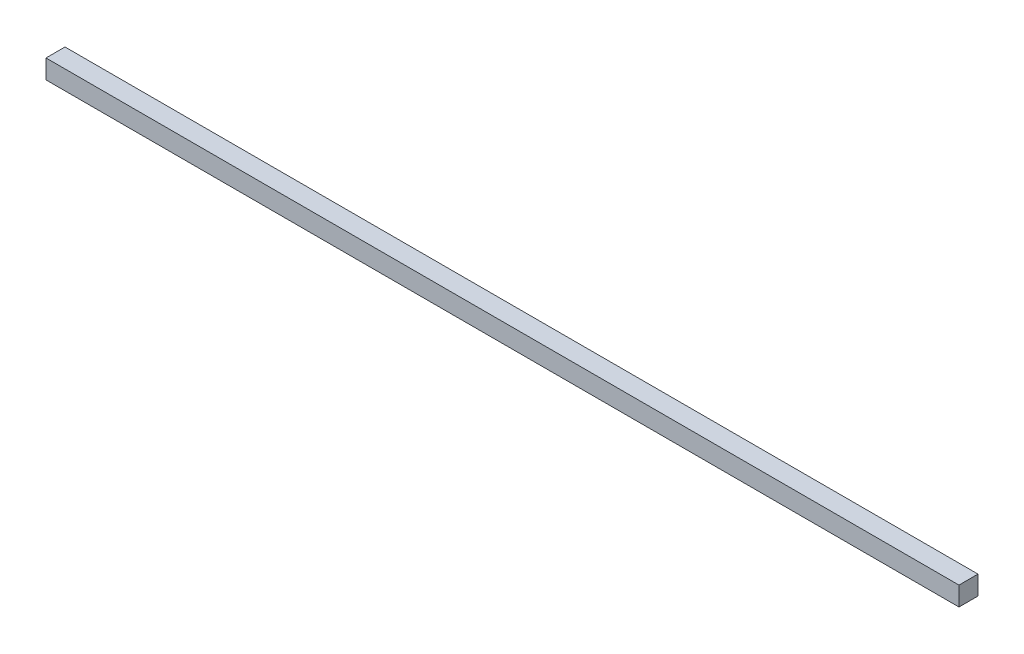
ISO-10303-21;
HEADER;
FILE_DESCRIPTION(('STEP AP214'),'2;1');
FILE_NAME('part.step','',(''),(''),'','','');
FILE_SCHEMA(('AUTOMOTIVE_DESIGN { 1 0 10303 214 1 1 1 1 }'));
ENDSEC;
DATA;
#1=APPLICATION_CONTEXT('core data for automotive mechanical design processes');
#2=APPLICATION_PROTOCOL_DEFINITION('international standard','automotive_design',2000,#1);
#3=PRODUCT_CONTEXT('',#1,'mechanical');
#4=PRODUCT('Part','Part','',(#3));
#5=PRODUCT_RELATED_PRODUCT_CATEGORY('part','',(#4));
#6=PRODUCT_DEFINITION_FORMATION('','',#4);
#7=PRODUCT_DEFINITION_CONTEXT('part definition',#1,'design');
#8=PRODUCT_DEFINITION('design','',#6,#7);
#9=PRODUCT_DEFINITION_SHAPE('','',#8);
#10=(LENGTH_UNIT() NAMED_UNIT(*) SI_UNIT(.MILLI.,.METRE.));
#11=(NAMED_UNIT(*) PLANE_ANGLE_UNIT() SI_UNIT($,.RADIAN.));
#12=(NAMED_UNIT(*) SI_UNIT($,.STERADIAN.) SOLID_ANGLE_UNIT());
#13=UNCERTAINTY_MEASURE_WITH_UNIT(LENGTH_MEASURE(1.E-05),#10,'distance_accuracy_value','');
#14=(GEOMETRIC_REPRESENTATION_CONTEXT(3) GLOBAL_UNCERTAINTY_ASSIGNED_CONTEXT((#13)) GLOBAL_UNIT_ASSIGNED_CONTEXT((#10,
#11,#12)) REPRESENTATION_CONTEXT('',''));
#15=CARTESIAN_POINT('',(0.,0.,0.));
#16=DIRECTION('',(0.,0.,1.));
#17=DIRECTION('',(1.,0.,0.));
#18=AXIS2_PLACEMENT_3D('',#15,#16,#17);
#19=CARTESIAN_POINT('',(152.4,3.175,-3.175));
#20=DIRECTION('',(0.,0.,1.));
#21=DIRECTION('',(0.,-1.,0.));
#22=AXIS2_PLACEMENT_3D('',#19,#20,#21);
#23=PLANE('',#22);
#24=DIRECTION('',(0.,1.,0.));
#25=VECTOR('',#24,1.);
#26=CARTESIAN_POINT('',(-152.4,3.175,-3.175));
#27=LINE('',#26,#25);
#28=CARTESIAN_POINT('',(-152.4,-3.175,-3.175));
#29=VERTEX_POINT('',#28);
#30=CARTESIAN_POINT('',(-152.4,3.175,-3.175));
#31=VERTEX_POINT('',#30);
#32=EDGE_CURVE('E119',#29,#31,#27,.T.);
#33=ORIENTED_EDGE('',*,*,#32,.T.);
#34=DIRECTION('',(-1.,0.,0.));
#35=VECTOR('',#34,1.);
#36=CARTESIAN_POINT('',(152.4,3.175,-3.175));
#37=LINE('',#36,#35);
#38=CARTESIAN_POINT('',(152.4,3.175,-3.175));
#39=VERTEX_POINT('',#38);
#40=EDGE_CURVE('E11',#39,#31,#37,.T.);
#41=ORIENTED_EDGE('',*,*,#40,.F.);
#42=DIRECTION('',(0.,1.,0.));
#43=VECTOR('',#42,1.);
#44=CARTESIAN_POINT('',(152.4,3.175,-3.175));
#45=LINE('',#44,#43);
#46=CARTESIAN_POINT('',(152.4,-3.175,-3.175));
#47=VERTEX_POINT('',#46);
#48=EDGE_CURVE('E103',#47,#39,#45,.T.);
#49=ORIENTED_EDGE('',*,*,#48,.F.);
#50=DIRECTION('',(-1.,0.,0.));
#51=VECTOR('',#50,1.);
#52=CARTESIAN_POINT('',(152.4,-3.175,-3.175));
#53=LINE('',#52,#51);
#54=EDGE_CURVE('E115',#47,#29,#53,.T.);
#55=ORIENTED_EDGE('',*,*,#54,.T.);
#56=EDGE_LOOP('',(#33,#41,#49,#55));
#57=FACE_BOUND('',#56,.T.);
#58=ADVANCED_FACE('F51',(#57),#23,.F.);
#59=CARTESIAN_POINT('',(152.4,3.175,3.175));
#60=DIRECTION('',(0.,-1.,0.));
#61=DIRECTION('',(0.,0.,-1.));
#62=AXIS2_PLACEMENT_3D('',#59,#60,#61);
#63=PLANE('',#62);
#64=DIRECTION('',(0.,0.,1.));
#65=VECTOR('',#64,1.);
#66=CARTESIAN_POINT('',(-152.4,3.175,3.175));
#67=LINE('',#66,#65);
#68=CARTESIAN_POINT('',(-152.4,3.175,3.175));
#69=VERTEX_POINT('',#68);
#70=EDGE_CURVE('E108',#31,#69,#67,.T.);
#71=ORIENTED_EDGE('',*,*,#70,.T.);
#72=DIRECTION('',(-1.,0.,0.));
#73=VECTOR('',#72,1.);
#74=CARTESIAN_POINT('',(152.4,3.175,3.175));
#75=LINE('',#74,#73);
#76=CARTESIAN_POINT('',(152.4,3.175,3.175));
#77=VERTEX_POINT('',#76);
#78=EDGE_CURVE('E60',#77,#69,#75,.T.);
#79=ORIENTED_EDGE('',*,*,#78,.F.);
#80=DIRECTION('',(0.,0.,1.));
#81=VECTOR('',#80,1.);
#82=CARTESIAN_POINT('',(152.4,3.175,3.175));
#83=LINE('',#82,#81);
#84=EDGE_CURVE('E98',#39,#77,#83,.T.);
#85=ORIENTED_EDGE('',*,*,#84,.F.);
#86=ORIENTED_EDGE('',*,*,#40,.T.);
#87=EDGE_LOOP('',(#71,#79,#85,#86));
#88=FACE_BOUND('',#87,.T.);
#89=ADVANCED_FACE('F107',(#88),#63,.F.);
#90=CARTESIAN_POINT('',(152.4,3.175,3.175));
#91=DIRECTION('',(0.,0.,-1.));
#92=DIRECTION('',(0.,1.,0.));
#93=AXIS2_PLACEMENT_3D('',#90,#91,#92);
#94=PLANE('',#93);
#95=DIRECTION('',(0.,-1.,0.));
#96=VECTOR('',#95,1.);
#97=CARTESIAN_POINT('',(-152.4,3.175,3.175));
#98=LINE('',#97,#96);
#99=CARTESIAN_POINT('',(-152.4,-3.175,3.175));
#100=VERTEX_POINT('',#99);
#101=EDGE_CURVE('E85',#69,#100,#98,.T.);
#102=ORIENTED_EDGE('',*,*,#101,.T.);
#103=DIRECTION('',(-1.,0.,0.));
#104=VECTOR('',#103,1.);
#105=CARTESIAN_POINT('',(152.4,-3.175,3.175));
#106=LINE('',#105,#104);
#107=CARTESIAN_POINT('',(152.4,-3.175,3.175));
#108=VERTEX_POINT('',#107);
#109=EDGE_CURVE('E110',#108,#100,#106,.T.);
#110=ORIENTED_EDGE('',*,*,#109,.F.);
#111=DIRECTION('',(0.,-1.,0.));
#112=VECTOR('',#111,1.);
#113=CARTESIAN_POINT('',(152.4,3.175,3.175));
#114=LINE('',#113,#112);
#115=EDGE_CURVE('E101',#77,#108,#114,.T.);
#116=ORIENTED_EDGE('',*,*,#115,.F.);
#117=ORIENTED_EDGE('',*,*,#78,.T.);
#118=EDGE_LOOP('',(#102,#110,#116,#117));
#119=FACE_BOUND('',#118,.T.);
#120=ADVANCED_FACE('F111',(#119),#94,.F.);
#121=CARTESIAN_POINT('',(152.4,-3.175,3.175));
#122=DIRECTION('',(0.,1.,0.));
#123=DIRECTION('',(0.,0.,1.));
#124=AXIS2_PLACEMENT_3D('',#121,#122,#123);
#125=PLANE('',#124);
#126=DIRECTION('',(0.,0.,-1.));
#127=VECTOR('',#126,1.);
#128=CARTESIAN_POINT('',(-152.4,-3.175,3.175));
#129=LINE('',#128,#127);
#130=EDGE_CURVE('E91',#100,#29,#129,.T.);
#131=ORIENTED_EDGE('',*,*,#130,.T.);
#132=ORIENTED_EDGE('',*,*,#54,.F.);
#133=DIRECTION('',(0.,0.,-1.));
#134=VECTOR('',#133,1.);
#135=CARTESIAN_POINT('',(152.4,-3.175,3.175));
#136=LINE('',#135,#134);
#137=EDGE_CURVE('E68',#108,#47,#136,.T.);
#138=ORIENTED_EDGE('',*,*,#137,.F.);
#139=ORIENTED_EDGE('',*,*,#109,.T.);
#140=EDGE_LOOP('',(#131,#132,#138,#139));
#141=FACE_BOUND('',#140,.T.);
#142=ADVANCED_FACE('F132',(#141),#125,.F.);
#143=CARTESIAN_POINT('',(152.4,0.,0.));
#144=DIRECTION('',(1.,0.,0.));
#145=DIRECTION('',(0.,0.,-1.));
#146=AXIS2_PLACEMENT_3D('',#143,#144,#145);
#147=PLANE('',#146);
#148=ORIENTED_EDGE('',*,*,#48,.T.);
#149=ORIENTED_EDGE('',*,*,#84,.T.);
#150=ORIENTED_EDGE('',*,*,#115,.T.);
#151=ORIENTED_EDGE('',*,*,#137,.T.);
#152=EDGE_LOOP('',(#148,#149,#150,#151));
#153=FACE_BOUND('',#152,.T.);
#154=ADVANCED_FACE('F99',(#153),#147,.T.);
#155=CARTESIAN_POINT('',(-152.4,0.,0.));
#156=DIRECTION('',(1.,0.,0.));
#157=DIRECTION('',(0.,0.,-1.));
#158=AXIS2_PLACEMENT_3D('',#155,#156,#157);
#159=PLANE('',#158);
#160=ORIENTED_EDGE('',*,*,#32,.F.);
#161=ORIENTED_EDGE('',*,*,#130,.F.);
#162=ORIENTED_EDGE('',*,*,#101,.F.);
#163=ORIENTED_EDGE('',*,*,#70,.F.);
#164=EDGE_LOOP('',(#160,#161,#162,#163));
#165=FACE_BOUND('',#164,.T.);
#166=ADVANCED_FACE('F135',(#165),#159,.F.);
#167=CLOSED_SHELL('',(#58,#89,#120,#142,#154,#166));
#168=MANIFOLD_SOLID_BREP('B2',#167);
#169=ADVANCED_BREP_SHAPE_REPRESENTATION('',(#18,#168),#14);
#170=SHAPE_DEFINITION_REPRESENTATION(#9,#169);
ENDSEC;
END-ISO-10303-21;
